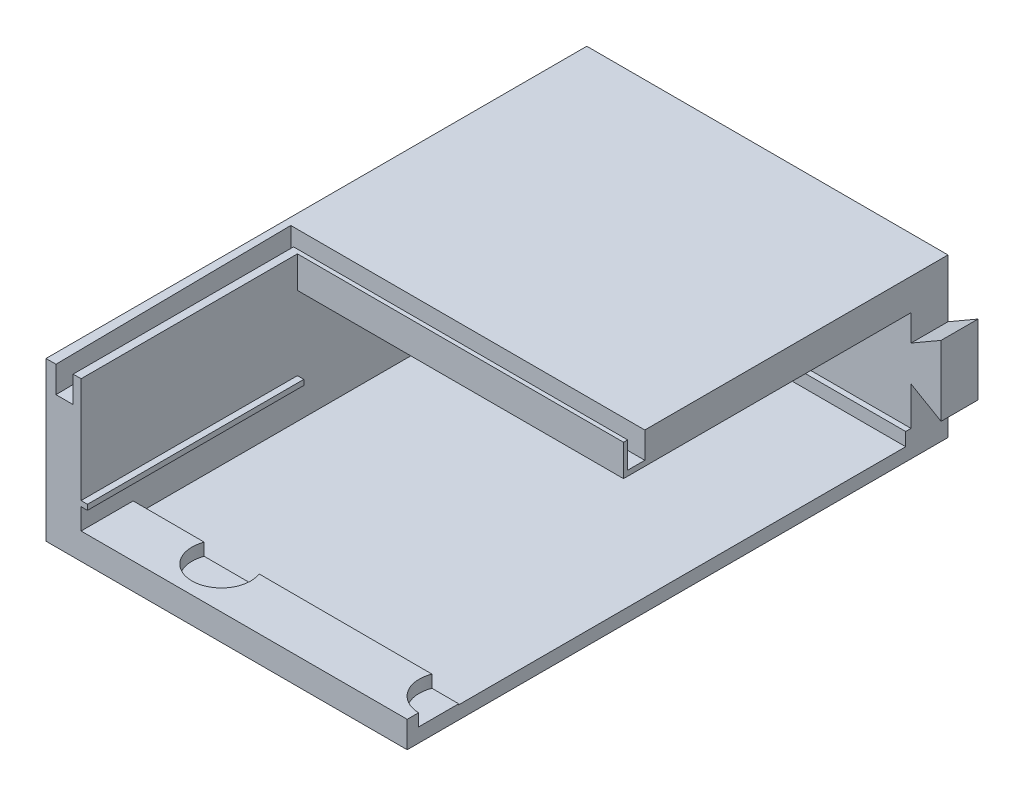
ISO-10303-21;
HEADER;
FILE_DESCRIPTION(('STEP AP214'),'2;1');
FILE_NAME('part.step','',(''),(''),'','','');
FILE_SCHEMA(('AUTOMOTIVE_DESIGN { 1 0 10303 214 1 1 1 1 }'));
ENDSEC;
DATA;
#1=APPLICATION_CONTEXT('core data for automotive mechanical design processes');
#2=APPLICATION_PROTOCOL_DEFINITION('international standard','automotive_design',2000,#1);
#3=PRODUCT_CONTEXT('',#1,'mechanical');
#4=PRODUCT('Part','Part','',(#3));
#5=PRODUCT_RELATED_PRODUCT_CATEGORY('part','',(#4));
#6=PRODUCT_DEFINITION_FORMATION('','',#4);
#7=PRODUCT_DEFINITION_CONTEXT('part definition',#1,'design');
#8=PRODUCT_DEFINITION('design','',#6,#7);
#9=PRODUCT_DEFINITION_SHAPE('','',#8);
#10=(LENGTH_UNIT() NAMED_UNIT(*) SI_UNIT(.MILLI.,.METRE.));
#11=(NAMED_UNIT(*) PLANE_ANGLE_UNIT() SI_UNIT($,.RADIAN.));
#12=(NAMED_UNIT(*) SI_UNIT($,.STERADIAN.) SOLID_ANGLE_UNIT());
#13=UNCERTAINTY_MEASURE_WITH_UNIT(LENGTH_MEASURE(1.E-05),#10,'distance_accuracy_value','');
#14=(GEOMETRIC_REPRESENTATION_CONTEXT(3) GLOBAL_UNCERTAINTY_ASSIGNED_CONTEXT((#13)) GLOBAL_UNIT_ASSIGNED_CONTEXT((#10,
#11,#12)) REPRESENTATION_CONTEXT('',''));
#15=CARTESIAN_POINT('',(0.,0.,0.));
#16=DIRECTION('',(0.,0.,1.));
#17=DIRECTION('',(1.,0.,0.));
#18=AXIS2_PLACEMENT_3D('',#15,#16,#17);
#19=CARTESIAN_POINT('',(131.625,38.0210152059206,-115.01));
#20=DIRECTION('',(1.,0.,0.));
#21=DIRECTION('',(0.,0.,-1.));
#22=AXIS2_PLACEMENT_3D('',#19,#20,#21);
#23=PLANE('',#22);
#24=DIRECTION('',(0.,-1.,0.));
#25=VECTOR('',#24,1.);
#26=CARTESIAN_POINT('',(131.625,60.,-115.));
#27=LINE('',#26,#25);
#28=CARTESIAN_POINT('',(131.625,59.9507551826827,-115.));
#29=VERTEX_POINT('',#28);
#30=CARTESIAN_POINT('',(131.625,38.0210152059206,-115.));
#31=VERTEX_POINT('',#30);
#32=EDGE_CURVE('E391',#29,#31,#27,.T.);
#33=ORIENTED_EDGE('',*,*,#32,.F.);
#34=DIRECTION('',(0.,0.,1.));
#35=VECTOR('',#34,1.);
#36=CARTESIAN_POINT('',(131.625,59.9507551826827,-115.01));
#37=LINE('',#36,#35);
#38=CARTESIAN_POINT('',(131.625,59.9507551826827,-0.0612445611802554));
#39=VERTEX_POINT('',#38);
#40=EDGE_CURVE('E348',#29,#39,#37,.T.);
#41=ORIENTED_EDGE('',*,*,#40,.T.);
#42=DIRECTION('',(0.,1.,0.));
#43=VECTOR('',#42,1.);
#44=CARTESIAN_POINT('',(131.625,50.,-0.0612445611802554));
#45=LINE('',#44,#43);
#46=CARTESIAN_POINT('',(131.625,50.,-0.0612445611802554));
#47=VERTEX_POINT('',#46);
#48=EDGE_CURVE('E383',#47,#39,#45,.T.);
#49=ORIENTED_EDGE('',*,*,#48,.F.);
#50=DIRECTION('',(0.,0.,-1.));
#51=VECTOR('',#50,1.);
#52=CARTESIAN_POINT('',(131.625,50.,0.));
#53=LINE('',#52,#51);
#54=CARTESIAN_POINT('',(131.625,50.,6.43875543881975));
#55=VERTEX_POINT('',#54);
#56=EDGE_CURVE('E377',#55,#47,#53,.T.);
#57=ORIENTED_EDGE('',*,*,#56,.F.);
#58=DIRECTION('',(0.,1.,0.));
#59=VECTOR('',#58,1.);
#60=CARTESIAN_POINT('',(131.625,50.,6.43875543881975));
#61=LINE('',#60,#59);
#62=CARTESIAN_POINT('',(131.625,59.9507551826827,6.43875543881975));
#63=VERTEX_POINT('',#62);
#64=EDGE_CURVE('E419',#55,#63,#61,.T.);
#65=ORIENTED_EDGE('',*,*,#64,.T.);
#66=CARTESIAN_POINT('',(131.625,59.9507551826827,8.));
#67=VERTEX_POINT('',#66);
#68=EDGE_CURVE('E53',#63,#67,#37,.T.);
#69=ORIENTED_EDGE('',*,*,#68,.T.);
#70=DIRECTION('',(0.,-1.,0.));
#71=VECTOR('',#70,1.);
#72=CARTESIAN_POINT('',(131.625,9.99999999999999,8.));
#73=LINE('',#72,#71);
#74=CARTESIAN_POINT('',(131.625,48.,8.));
#75=VERTEX_POINT('',#74);
#76=EDGE_CURVE('E258',#67,#75,#73,.T.);
#77=ORIENTED_EDGE('',*,*,#76,.T.);
#78=DIRECTION('',(0.,0.,-1.));
#79=VECTOR('',#78,1.);
#80=CARTESIAN_POINT('',(131.625,48.,-101.));
#81=LINE('',#80,#79);
#82=CARTESIAN_POINT('',(131.625,48.,-101.));
#83=VERTEX_POINT('',#82);
#84=EDGE_CURVE('E266',#75,#83,#81,.T.);
#85=ORIENTED_EDGE('',*,*,#84,.T.);
#86=DIRECTION('',(0.,1.,0.));
#87=VECTOR('',#86,1.);
#88=CARTESIAN_POINT('',(131.625,0.,-101.));
#89=LINE('',#88,#87);
#90=CARTESIAN_POINT('',(131.625,38.0210152059206,-101.));
#91=VERTEX_POINT('',#90);
#92=EDGE_CURVE('E356',#91,#83,#89,.T.);
#93=ORIENTED_EDGE('',*,*,#92,.F.);
#94=DIRECTION('',(0.,0.,1.));
#95=VECTOR('',#94,1.);
#96=CARTESIAN_POINT('',(131.625,38.0210152059206,-115.01));
#97=LINE('',#96,#95);
#98=EDGE_CURVE('E11',#31,#91,#97,.T.);
#99=ORIENTED_EDGE('',*,*,#98,.F.);
#100=EDGE_LOOP('',(#33,#41,#49,#57,#65,#69,#77,#85,#93,#99));
#101=FACE_BOUND('',#100,.T.);
#102=ADVANCED_FACE('F43',(#101),#23,.T.);
#103=CARTESIAN_POINT('',(-5.2976725084512,60.,-115.01));
#104=DIRECTION('',(0.000359654199192794,0.999999935324426,0.));
#105=DIRECTION('',(-0.999999935324427,0.000359654199192794,0.));
#106=AXIS2_PLACEMENT_3D('',#103,#104,#105);
#107=PLANE('',#106);
#108=DIRECTION('',(0.999999935324427,-0.000359654199192794,0.));
#109=VECTOR('',#108,1.);
#110=CARTESIAN_POINT('',(-5.2976725084512,60.,-115.));
#111=LINE('',#110,#109);
#112=CARTESIAN_POINT('',(-5.2976725084512,60.,-115.));
#113=VERTEX_POINT('',#112);
#114=EDGE_CURVE('E406',#113,#29,#111,.T.);
#115=ORIENTED_EDGE('',*,*,#114,.F.);
#116=DIRECTION('',(0.,0.,-1.));
#117=VECTOR('',#116,1.);
#118=CARTESIAN_POINT('',(-5.2976725084512,60.,90.));
#119=LINE('',#118,#117);
#120=CARTESIAN_POINT('',(-5.2976725084512,60.,90.));
#121=VERTEX_POINT('',#120);
#122=EDGE_CURVE('E285',#121,#113,#119,.T.);
#123=ORIENTED_EDGE('',*,*,#122,.F.);
#124=DIRECTION('',(-0.999999935324427,0.000359654199192794,0.));
#125=VECTOR('',#124,1.);
#126=CARTESIAN_POINT('',(-6.8525998317018E-07,59.9980946699596,90.));
#127=LINE('',#126,#125);
#128=CARTESIAN_POINT('',(-1.5186079351983,59.9986408434693,90.000001141251));
#129=VERTEX_POINT('',#128);
#130=EDGE_CURVE('E412',#129,#121,#127,.T.);
#131=ORIENTED_EDGE('',*,*,#130,.F.);
#132=DIRECTION('',(0.0116493265600538,-4.18972948606465E-06,0.999932144284373));
#133=VECTOR('',#132,1.);
#134=CARTESIAN_POINT('',(-1.51860744718936,59.9986408432938,90.0000430300088));
#135=LINE('',#134,#133);
#136=CARTESIAN_POINT('',(-2.56783199264043,59.9990182013319,-0.0612445611802554));
#137=VERTEX_POINT('',#136);
#138=EDGE_CURVE('E379',#137,#129,#135,.T.);
#139=ORIENTED_EDGE('',*,*,#138,.F.);
#140=DIRECTION('',(-0.999999935324427,0.000359654199192794,0.));
#141=VECTOR('',#140,1.);
#142=CARTESIAN_POINT('',(-2.5642358039891,59.9990169079474,-0.0612445611802538));
#143=LINE('',#142,#141);
#144=EDGE_CURVE('E386',#39,#137,#143,.T.);
#145=ORIENTED_EDGE('',*,*,#144,.F.);
#146=ORIENTED_EDGE('',*,*,#40,.F.);
#147=EDGE_LOOP('',(#115,#123,#131,#139,#145,#146));
#148=FACE_BOUND('',#147,.T.);
#149=ADVANCED_FACE('F505',(#148),#107,.T.);
#150=ORIENTED_EDGE('',*,*,#68,.F.);
#151=DIRECTION('',(-0.999999935324427,0.000359654199192794,0.));
#152=VECTOR('',#151,1.);
#153=CARTESIAN_POINT('',(4.98498727695216,59.9963017979901,6.43875543881975));
#154=LINE('',#153,#152);
#155=CARTESIAN_POINT('',(4.98139206480159,59.9963030910234,6.43875543881975));
#156=VERTEX_POINT('',#155);
#157=EDGE_CURVE('E270',#63,#156,#154,.T.);
#158=ORIENTED_EDGE('',*,*,#157,.T.);
#159=DIRECTION('',(0.,0.,-1.));
#160=VECTOR('',#159,1.);
#161=CARTESIAN_POINT('',(4.98139206480159,59.9963030910234,6.43875543881975));
#162=LINE('',#161,#160);
#163=CARTESIAN_POINT('',(4.9813920648016,59.9963030910234,90.));
#164=VERTEX_POINT('',#163);
#165=EDGE_CURVE('E381',#164,#156,#162,.T.);
#166=ORIENTED_EDGE('',*,*,#165,.F.);
#167=CARTESIAN_POINT('',(8.00000000000001,59.9952174359335,90.));
#168=VERTEX_POINT('',#167);
#169=EDGE_CURVE('E415',#168,#164,#127,.T.);
#170=ORIENTED_EDGE('',*,*,#169,.F.);
#171=DIRECTION('',(0.,0.,-1.));
#172=VECTOR('',#171,1.);
#173=CARTESIAN_POINT('',(8.,59.9952174359335,8.));
#174=LINE('',#173,#172);
#175=CARTESIAN_POINT('',(8.,59.9952174359335,8.));
#176=VERTEX_POINT('',#175);
#177=EDGE_CURVE('E421',#168,#176,#174,.T.);
#178=ORIENTED_EDGE('',*,*,#177,.T.);
#179=DIRECTION('',(0.999999935324426,-0.000359654199192794,0.));
#180=VECTOR('',#179,1.);
#181=CARTESIAN_POINT('',(255.267949006657,59.9062864739958,8.));
#182=LINE('',#181,#180);
#183=EDGE_CURVE('E269',#176,#67,#182,.T.);
#184=ORIENTED_EDGE('',*,*,#183,.T.);
#185=EDGE_LOOP('',(#150,#158,#166,#170,#178,#184));
#186=FACE_BOUND('',#185,.T.);
#187=ADVANCED_FACE('F519',(#186),#107,.T.);
#188=CARTESIAN_POINT('',(142.996381437181,44.5862853397348,-115.01));
#189=DIRECTION('',(-0.499999999999997,0.86602540378444,0.));
#190=DIRECTION('',(-0.86602540378444,-0.499999999999997,0.));
#191=AXIS2_PLACEMENT_3D('',#188,#189,#190);
#192=PLANE('',#191);
#193=DIRECTION('',(0.86602540378444,0.499999999999997,0.));
#194=VECTOR('',#193,1.);
#195=CARTESIAN_POINT('',(38.4501752091935,-15.7734949687474,-115.));
#196=LINE('',#195,#194);
#197=CARTESIAN_POINT('',(142.996381437181,44.5862853397348,-115.));
#198=VERTEX_POINT('',#197);
#199=EDGE_CURVE('E394',#31,#198,#196,.T.);
#200=ORIENTED_EDGE('',*,*,#199,.F.);
#201=ORIENTED_EDGE('',*,*,#98,.T.);
#202=DIRECTION('',(-0.86602540378444,-0.499999999999997,0.));
#203=VECTOR('',#202,1.);
#204=CARTESIAN_POINT('',(16.4426674769989,-28.4795354821226,-101.));
#205=LINE('',#204,#203);
#206=CARTESIAN_POINT('',(142.996381437181,44.5862853397348,-101.));
#207=VERTEX_POINT('',#206);
#208=EDGE_CURVE('E359',#207,#91,#205,.T.);
#209=ORIENTED_EDGE('',*,*,#208,.F.);
#210=DIRECTION('',(0.,0.,1.));
#211=VECTOR('',#210,1.);
#212=CARTESIAN_POINT('',(142.996381437181,44.5862853397348,-115.01));
#213=LINE('',#212,#211);
#214=EDGE_CURVE('E349',#198,#207,#213,.T.);
#215=ORIENTED_EDGE('',*,*,#214,.F.);
#216=EDGE_LOOP('',(#200,#201,#209,#215));
#217=FACE_BOUND('',#216,.T.);
#218=ADVANCED_FACE('F515',(#217),#192,.T.);
#219=CARTESIAN_POINT('',(142.996381437181,44.5862853397348,-115.01));
#220=DIRECTION('',(1.,0.,0.));
#221=DIRECTION('',(0.,0.,-1.));
#222=AXIS2_PLACEMENT_3D('',#219,#220,#221);
#223=PLANE('',#222);
#224=DIRECTION('',(0.,-1.,0.));
#225=VECTOR('',#224,1.);
#226=CARTESIAN_POINT('',(142.996381437181,60.,-115.));
#227=LINE('',#226,#225);
#228=CARTESIAN_POINT('',(142.996381437181,18.0143801043625,-115.));
#229=VERTEX_POINT('',#228);
#230=EDGE_CURVE('E397',#198,#229,#227,.T.);
#231=ORIENTED_EDGE('',*,*,#230,.F.);
#232=ORIENTED_EDGE('',*,*,#214,.T.);
#233=DIRECTION('',(0.,1.,0.));
#234=VECTOR('',#233,1.);
#235=CARTESIAN_POINT('',(142.996381437181,0.,-101.));
#236=LINE('',#235,#234);
#237=CARTESIAN_POINT('',(142.996381437181,18.0143801043625,-101.));
#238=VERTEX_POINT('',#237);
#239=EDGE_CURVE('E362',#238,#207,#236,.T.);
#240=ORIENTED_EDGE('',*,*,#239,.F.);
#241=DIRECTION('',(0.,0.,1.));
#242=VECTOR('',#241,1.);
#243=CARTESIAN_POINT('',(142.996381437181,18.0143801043625,-115.01));
#244=LINE('',#243,#242);
#245=EDGE_CURVE('E351',#229,#238,#244,.T.);
#246=ORIENTED_EDGE('',*,*,#245,.F.);
#247=EDGE_LOOP('',(#231,#232,#240,#246));
#248=FACE_BOUND('',#247,.T.);
#249=ADVANCED_FACE('F518',(#248),#223,.T.);
#250=CARTESIAN_POINT('',(142.996381437181,18.0143801043625,-115.01));
#251=DIRECTION('',(-0.499999999999997,-0.866025403784441,0.));
#252=DIRECTION('',(0.866025403784441,-0.499999999999997,0.));
#253=AXIS2_PLACEMENT_3D('',#250,#251,#252);
#254=PLANE('',#253);
#255=DIRECTION('',(-0.866025403784441,0.499999999999997,0.));
#256=VECTOR('',#255,1.);
#257=CARTESIAN_POINT('',(13.5955342663267,92.7239940518201,-115.));
#258=LINE('',#257,#256);
#259=CARTESIAN_POINT('',(131.625,24.5796502381768,-115.));
#260=VERTEX_POINT('',#259);
#261=EDGE_CURVE('E400',#229,#260,#258,.T.);
#262=ORIENTED_EDGE('',*,*,#261,.F.);
#263=ORIENTED_EDGE('',*,*,#245,.T.);
#264=DIRECTION('',(0.866025403784441,-0.499999999999997,0.));
#265=VECTOR('',#264,1.);
#266=CARTESIAN_POINT('',(43.5495507611981,75.4300345651957,-101.));
#267=LINE('',#266,#265);
#268=CARTESIAN_POINT('',(131.625,24.5796502381768,-101.));
#269=VERTEX_POINT('',#268);
#270=EDGE_CURVE('E365',#269,#238,#267,.T.);
#271=ORIENTED_EDGE('',*,*,#270,.F.);
#272=DIRECTION('',(0.,0.,1.));
#273=VECTOR('',#272,1.);
#274=CARTESIAN_POINT('',(131.625,24.5796502381768,-115.01));
#275=LINE('',#274,#273);
#276=EDGE_CURVE('E261',#260,#269,#275,.T.);
#277=ORIENTED_EDGE('',*,*,#276,.F.);
#278=EDGE_LOOP('',(#262,#263,#271,#277));
#279=FACE_BOUND('',#278,.T.);
#280=ADVANCED_FACE('F476',(#279),#254,.T.);
#281=CARTESIAN_POINT('',(131.625,-0.0543782899306133,-115.01));
#282=DIRECTION('',(1.,0.,0.));
#283=DIRECTION('',(0.,1.,0.));
#284=AXIS2_PLACEMENT_3D('',#281,#282,#283);
#285=PLANE('',#284);
#286=DIRECTION('',(0.,-1.,0.));
#287=VECTOR('',#286,1.);
#288=CARTESIAN_POINT('',(131.624999999999,60.0000000000012,-115.));
#289=LINE('',#288,#287);
#290=CARTESIAN_POINT('',(131.625,0.,-115.));
#291=VERTEX_POINT('',#290);
#292=EDGE_CURVE('E403',#260,#291,#289,.T.);
#293=ORIENTED_EDGE('',*,*,#292,.F.);
#294=ORIENTED_EDGE('',*,*,#276,.T.);
#295=DIRECTION('',(0.,1.,0.));
#296=VECTOR('',#295,1.);
#297=CARTESIAN_POINT('',(131.625,1.18643286825416E-12,-101.));
#298=LINE('',#297,#296);
#299=CARTESIAN_POINT('',(131.625,9.99999999999999,-101.));
#300=VERTEX_POINT('',#299);
#301=EDGE_CURVE('E368',#300,#269,#298,.T.);
#302=ORIENTED_EDGE('',*,*,#301,.F.);
#303=DIRECTION('',(0.,0.,1.));
#304=VECTOR('',#303,1.);
#305=CARTESIAN_POINT('',(131.625,9.99999999999999,-101.));
#306=LINE('',#305,#304);
#307=CARTESIAN_POINT('',(131.625,9.99999999999999,-98.9628021729257));
#308=VERTEX_POINT('',#307);
#309=EDGE_CURVE('E274',#300,#308,#306,.T.);
#310=ORIENTED_EDGE('',*,*,#309,.T.);
#311=DIRECTION('',(0.,-1.,0.));
#312=VECTOR('',#311,1.);
#313=CARTESIAN_POINT('',(131.625,5.00000000000111,-98.9628021729257));
#314=LINE('',#313,#312);
#315=CARTESIAN_POINT('',(131.625,4.99999999999999,-98.9628021729257));
#316=VERTEX_POINT('',#315);
#317=EDGE_CURVE('E430',#308,#316,#314,.T.);
#318=ORIENTED_EDGE('',*,*,#317,.T.);
#319=DIRECTION('',(0.,0.,1.));
#320=VECTOR('',#319,1.);
#321=CARTESIAN_POINT('',(131.625,4.99999999999999,0.));
#322=LINE('',#321,#320);
#323=CARTESIAN_POINT('',(131.625,4.99999999999999,70.4851481283429));
#324=VERTEX_POINT('',#323);
#325=EDGE_CURVE('E277',#316,#324,#322,.T.);
#326=ORIENTED_EDGE('',*,*,#325,.T.);
#327=DIRECTION('',(0.,1.,0.));
#328=VECTOR('',#327,1.);
#329=CARTESIAN_POINT('',(131.625,5.00000000000111,70.4851481283429));
#330=LINE('',#329,#328);
#331=CARTESIAN_POINT('',(131.625,5.33999999999999,70.485148128343));
#332=VERTEX_POINT('',#331);
#333=EDGE_CURVE('E427',#324,#332,#330,.T.);
#334=ORIENTED_EDGE('',*,*,#333,.T.);
#335=DIRECTION('',(0.,0.,-1.));
#336=VECTOR('',#335,1.);
#337=CARTESIAN_POINT('',(131.625,5.33999999999999,74.522104321755));
#338=LINE('',#337,#336);
#339=CARTESIAN_POINT('',(131.625,5.33999999999999,85.6696744542363));
#340=VERTEX_POINT('',#339);
#341=EDGE_CURVE('E371',#340,#332,#338,.T.);
#342=ORIENTED_EDGE('',*,*,#341,.F.);
#343=DIRECTION('',(0.,1.,0.));
#344=VECTOR('',#343,1.);
#345=CARTESIAN_POINT('',(131.625,5.33999999999999,85.6696744542363));
#346=LINE('',#345,#344);
#347=CARTESIAN_POINT('',(131.625,9.99999999999999,85.6696744542363));
#348=VERTEX_POINT('',#347);
#349=EDGE_CURVE('E424',#340,#348,#346,.T.);
#350=ORIENTED_EDGE('',*,*,#349,.T.);
#351=DIRECTION('',(0.,0.,-1.));
#352=VECTOR('',#351,1.);
#353=CARTESIAN_POINT('',(131.625,9.99999999999999,0.));
#354=LINE('',#353,#352);
#355=CARTESIAN_POINT('',(131.625,9.99999999999999,90.));
#356=VERTEX_POINT('',#355);
#357=EDGE_CURVE('E374',#356,#348,#354,.T.);
#358=ORIENTED_EDGE('',*,*,#357,.F.);
#359=DIRECTION('',(0.,1.,0.));
#360=VECTOR('',#359,1.);
#361=CARTESIAN_POINT('',(131.624999999999,60.0000000000012,90.));
#362=LINE('',#361,#360);
#363=CARTESIAN_POINT('',(131.625,0.,90.));
#364=VERTEX_POINT('',#363);
#365=EDGE_CURVE('E409',#364,#356,#362,.T.);
#366=ORIENTED_EDGE('',*,*,#365,.F.);
#367=DIRECTION('',(0.,0.,1.));
#368=VECTOR('',#367,1.);
#369=CARTESIAN_POINT('',(131.625,0.,0.));
#370=LINE('',#369,#368);
#371=EDGE_CURVE('E389',#291,#364,#370,.T.);
#372=ORIENTED_EDGE('',*,*,#371,.F.);
#373=EDGE_LOOP('',(#293,#294,#302,#310,#318,#326,#334,#342,#350,#358,#366,#372));
#374=FACE_BOUND('',#373,.T.);
#375=ADVANCED_FACE('F436',(#374),#285,.T.);
#376=CARTESIAN_POINT('',(10.4282385352864,20.,4.99999999999999));
#377=DIRECTION('',(1.,0.,0.));
#378=DIRECTION('',(0.,0.,-1.));
#379=AXIS2_PLACEMENT_3D('',#376,#377,#378);
#380=PLANE('',#379);
#381=DIRECTION('',(0.,-1.,0.));
#382=VECTOR('',#381,1.);
#383=CARTESIAN_POINT('',(10.4282385352864,9.99999999999999,8.));
#384=LINE('',#383,#382);
#385=CARTESIAN_POINT('',(10.4282385352864,20.,8.));
#386=VERTEX_POINT('',#385);
#387=CARTESIAN_POINT('',(10.4282385352864,18.,8.));
#388=VERTEX_POINT('',#387);
#389=EDGE_CURVE('E358',#386,#388,#384,.T.);
#390=ORIENTED_EDGE('',*,*,#389,.F.);
#391=DIRECTION('',(0.,0.,1.));
#392=VECTOR('',#391,1.);
#393=CARTESIAN_POINT('',(10.4282385352864,20.,4.99999999999999));
#394=LINE('',#393,#392);
#395=CARTESIAN_POINT('',(10.4282385352864,20.,90.));
#396=VERTEX_POINT('',#395);
#397=EDGE_CURVE('E628',#386,#396,#394,.T.);
#398=ORIENTED_EDGE('',*,*,#397,.T.);
#399=DIRECTION('',(0.,1.,0.));
#400=VECTOR('',#399,1.);
#401=CARTESIAN_POINT('',(10.4282385352864,20.,90.));
#402=LINE('',#401,#400);
#403=CARTESIAN_POINT('',(10.4282385352864,18.,90.));
#404=VERTEX_POINT('',#403);
#405=EDGE_CURVE('E634',#404,#396,#402,.T.);
#406=ORIENTED_EDGE('',*,*,#405,.F.);
#407=DIRECTION('',(0.,0.,1.));
#408=VECTOR('',#407,1.);
#409=CARTESIAN_POINT('',(10.4282385352864,18.,4.99999999999999));
#410=LINE('',#409,#408);
#411=EDGE_CURVE('E629',#388,#404,#410,.T.);
#412=ORIENTED_EDGE('',*,*,#411,.F.);
#413=EDGE_LOOP('',(#390,#398,#406,#412));
#414=FACE_BOUND('',#413,.T.);
#415=ADVANCED_FACE('F492',(#414),#380,.T.);
#416=CARTESIAN_POINT('',(4.98139206480159,50.,6.43875543881975));
#417=DIRECTION('',(-1.,0.,0.));
#418=DIRECTION('',(0.,0.,1.));
#419=AXIS2_PLACEMENT_3D('',#416,#417,#418);
#420=PLANE('',#419);
#421=DIRECTION('',(0.,1.,0.));
#422=VECTOR('',#421,1.);
#423=CARTESIAN_POINT('',(4.9813920648016,50.,90.));
#424=LINE('',#423,#422);
#425=CARTESIAN_POINT('',(4.9813920648016,50.,90.));
#426=VERTEX_POINT('',#425);
#427=EDGE_CURVE('E291',#426,#164,#424,.T.);
#428=ORIENTED_EDGE('',*,*,#427,.T.);
#429=ORIENTED_EDGE('',*,*,#165,.T.);
#430=DIRECTION('',(0.,1.,0.));
#431=VECTOR('',#430,1.);
#432=CARTESIAN_POINT('',(4.98139206480159,50.,6.43875543881975));
#433=LINE('',#432,#431);
#434=CARTESIAN_POINT('',(4.98139206480159,50.,6.43875543881975));
#435=VERTEX_POINT('',#434);
#436=EDGE_CURVE('E288',#435,#156,#433,.T.);
#437=ORIENTED_EDGE('',*,*,#436,.F.);
#438=DIRECTION('',(0.,0.,1.));
#439=VECTOR('',#438,1.);
#440=CARTESIAN_POINT('',(4.98139206480159,50.,6.43875543881975));
#441=LINE('',#440,#439);
#442=EDGE_CURVE('E305',#435,#426,#441,.T.);
#443=ORIENTED_EDGE('',*,*,#442,.T.);
#444=EDGE_LOOP('',(#428,#429,#437,#443));
#445=FACE_BOUND('',#444,.T.);
#446=ADVANCED_FACE('F494',(#445),#420,.T.);
#447=CARTESIAN_POINT('',(10.4282385352864,18.,4.99999999999999));
#448=DIRECTION('',(0.,-1.,0.));
#449=DIRECTION('',(0.,0.,-1.));
#450=AXIS2_PLACEMENT_3D('',#447,#448,#449);
#451=PLANE('',#450);
#452=DIRECTION('',(-1.,0.,0.));
#453=VECTOR('',#452,1.);
#454=CARTESIAN_POINT('',(255.25,18.,8.));
#455=LINE('',#454,#453);
#456=CARTESIAN_POINT('',(8.00000000000001,18.,8.));
#457=VERTEX_POINT('',#456);
#458=EDGE_CURVE('E85',#388,#457,#455,.T.);
#459=ORIENTED_EDGE('',*,*,#458,.F.);
#460=ORIENTED_EDGE('',*,*,#411,.T.);
#461=DIRECTION('',(1.,0.,0.));
#462=VECTOR('',#461,1.);
#463=CARTESIAN_POINT('',(10.4282385352864,18.,90.));
#464=LINE('',#463,#462);
#465=CARTESIAN_POINT('',(7.99999999999999,18.,90.));
#466=VERTEX_POINT('',#465);
#467=EDGE_CURVE('E637',#466,#404,#464,.T.);
#468=ORIENTED_EDGE('',*,*,#467,.F.);
#469=DIRECTION('',(0.,0.,1.));
#470=VECTOR('',#469,1.);
#471=CARTESIAN_POINT('',(8.,18.,8.));
#472=LINE('',#471,#470);
#473=EDGE_CURVE('E856',#457,#466,#472,.T.);
#474=ORIENTED_EDGE('',*,*,#473,.F.);
#475=EDGE_LOOP('',(#459,#460,#468,#474));
#476=FACE_BOUND('',#475,.T.);
#477=ADVANCED_FACE('F501',(#476),#451,.T.);
#478=CARTESIAN_POINT('',(0.,0.,8.));
#479=DIRECTION('',(0.,0.,1.));
#480=DIRECTION('',(1.,0.,0.));
#481=AXIS2_PLACEMENT_3D('',#478,#479,#480);
#482=PLANE('',#481);
#483=DIRECTION('',(1.,0.,0.));
#484=VECTOR('',#483,1.);
#485=CARTESIAN_POINT('',(255.25,20.,8.));
#486=LINE('',#485,#484);
#487=CARTESIAN_POINT('',(8.00000000000001,20.,8.));
#488=VERTEX_POINT('',#487);
#489=EDGE_CURVE('E625',#488,#386,#486,.T.);
#490=ORIENTED_EDGE('',*,*,#489,.T.);
#491=ORIENTED_EDGE('',*,*,#389,.T.);
#492=ORIENTED_EDGE('',*,*,#458,.T.);
#493=DIRECTION('',(0.,-1.,0.));
#494=VECTOR('',#493,1.);
#495=CARTESIAN_POINT('',(8.00000000000001,48.,8.));
#496=LINE('',#495,#494);
#497=EDGE_CURVE('E80',#488,#457,#496,.T.);
#498=ORIENTED_EDGE('',*,*,#497,.F.);
#499=EDGE_LOOP('',(#490,#491,#492,#498));
#500=FACE_BOUND('',#499,.T.);
#501=ADVANCED_FACE('F513',(#500),#482,.F.);
#502=CARTESIAN_POINT('',(7.99999999999999,20.,4.99999999999999));
#503=DIRECTION('',(0.,1.,0.));
#504=DIRECTION('',(0.,0.,1.));
#505=AXIS2_PLACEMENT_3D('',#502,#503,#504);
#506=PLANE('',#505);
#507=ORIENTED_EDGE('',*,*,#489,.F.);
#508=DIRECTION('',(0.,0.,-1.));
#509=VECTOR('',#508,1.);
#510=CARTESIAN_POINT('',(8.,20.,8.));
#511=LINE('',#510,#509);
#512=CARTESIAN_POINT('',(8.00000000000001,20.,90.));
#513=VERTEX_POINT('',#512);
#514=EDGE_CURVE('E861',#513,#488,#511,.T.);
#515=ORIENTED_EDGE('',*,*,#514,.F.);
#516=DIRECTION('',(-1.,0.,0.));
#517=VECTOR('',#516,1.);
#518=CARTESIAN_POINT('',(7.99999999999999,20.,90.));
#519=LINE('',#518,#517);
#520=EDGE_CURVE('E631',#396,#513,#519,.T.);
#521=ORIENTED_EDGE('',*,*,#520,.F.);
#522=ORIENTED_EDGE('',*,*,#397,.F.);
#523=EDGE_LOOP('',(#507,#515,#521,#522));
#524=FACE_BOUND('',#523,.T.);
#525=ADVANCED_FACE('F510',(#524),#506,.T.);
#526=CARTESIAN_POINT('',(0.,60.,90.));
#527=DIRECTION('',(0.,0.,1.));
#528=DIRECTION('',(1.,0.,0.));
#529=AXIS2_PLACEMENT_3D('',#526,#527,#528);
#530=PLANE('',#529);
#531=DIRECTION('',(0.,1.,0.));
#532=VECTOR('',#531,1.);
#533=CARTESIAN_POINT('',(8.00000000000001,9.99999999999999,90.));
#534=LINE('',#533,#532);
#535=EDGE_CURVE('E311',#513,#168,#534,.T.);
#536=ORIENTED_EDGE('',*,*,#535,.T.);
#537=ORIENTED_EDGE('',*,*,#169,.T.);
#538=ORIENTED_EDGE('',*,*,#427,.F.);
#539=DIRECTION('',(0.999999999999985,0.,-1.75577074247057E-07));
#540=VECTOR('',#539,1.);
#541=CARTESIAN_POINT('',(-1.5186079351983,50.,90.000001141251));
#542=LINE('',#541,#540);
#543=CARTESIAN_POINT('',(-1.5186079351983,50.,90.000001141251));
#544=VERTEX_POINT('',#543);
#545=EDGE_CURVE('E600',#544,#426,#542,.T.);
#546=ORIENTED_EDGE('',*,*,#545,.F.);
#547=DIRECTION('',(0.,1.,0.));
#548=VECTOR('',#547,1.);
#549=CARTESIAN_POINT('',(-1.5186079351983,50.,90.000001141251));
#550=LINE('',#549,#548);
#551=EDGE_CURVE('E294',#544,#129,#550,.T.);
#552=ORIENTED_EDGE('',*,*,#551,.T.);
#553=ORIENTED_EDGE('',*,*,#130,.T.);
#554=DIRECTION('',(0.,-1.,0.));
#555=VECTOR('',#554,1.);
#556=CARTESIAN_POINT('',(-5.2976725084512,60.,90.));
#557=LINE('',#556,#555);
#558=CARTESIAN_POINT('',(-5.2976725084512,0.,90.));
#559=VERTEX_POINT('',#558);
#560=EDGE_CURVE('E355',#121,#559,#557,.T.);
#561=ORIENTED_EDGE('',*,*,#560,.T.);
#562=DIRECTION('',(-1.,0.,0.));
#563=VECTOR('',#562,1.);
#564=CARTESIAN_POINT('',(0.,0.,90.));
#565=LINE('',#564,#563);
#566=EDGE_CURVE('E286',#364,#559,#565,.T.);
#567=ORIENTED_EDGE('',*,*,#566,.F.);
#568=ORIENTED_EDGE('',*,*,#365,.T.);
#569=DIRECTION('',(1.,0.,0.));
#570=VECTOR('',#569,1.);
#571=CARTESIAN_POINT('',(8.00000000000001,9.99999999999999,90.));
#572=LINE('',#571,#570);
#573=CARTESIAN_POINT('',(8.00000000000001,9.99999999999999,90.));
#574=VERTEX_POINT('',#573);
#575=EDGE_CURVE('E313',#574,#356,#572,.T.);
#576=ORIENTED_EDGE('',*,*,#575,.F.);
#577=EDGE_CURVE('E308',#574,#466,#534,.T.);
#578=ORIENTED_EDGE('',*,*,#577,.T.);
#579=ORIENTED_EDGE('',*,*,#467,.T.);
#580=ORIENTED_EDGE('',*,*,#405,.T.);
#581=ORIENTED_EDGE('',*,*,#520,.T.);
#582=EDGE_LOOP('',(#536,#537,#538,#546,#552,#553,#561,#567,#568,#576,#578,#579,#580,#581));
#583=FACE_BOUND('',#582,.T.);
#584=ADVANCED_FACE('F463',(#583),#530,.T.);
#585=CARTESIAN_POINT('',(131.857766280656,5.33999999999999,74.522104321755));
#586=DIRECTION('',(0.,1.,0.));
#587=DIRECTION('',(0.,0.,1.));
#588=AXIS2_PLACEMENT_3D('',#585,#586,#587);
#589=PLANE('',#588);
#590=CARTESIAN_POINT('',(131.857766280656,5.33999999999999,74.522104321755));
#591=DIRECTION('',(0.,1.,0.));
#592=DIRECTION('',(0.,0.,1.));
#593=AXIS2_PLACEMENT_3D('',#590,#591,#592);
#594=CIRCLE('',#593,11.15);
#595=CARTESIAN_POINT('',(121.471660690305,5.33999999999999,70.4660827899976));
#596=VERTEX_POINT('',#595);
#597=EDGE_CURVE('E317',#596,#340,#594,.T.);
#598=ORIENTED_EDGE('',*,*,#597,.T.);
#599=ORIENTED_EDGE('',*,*,#341,.T.);
#600=DIRECTION('',(0.999998237049616,0.,0.00187773737807381));
#601=VECTOR('',#600,1.);
#602=CARTESIAN_POINT('',(131.86534579012,5.33999999999999,70.4855994354124));
#603=LINE('',#602,#601);
#604=EDGE_CURVE('E323',#596,#332,#603,.T.);
#605=ORIENTED_EDGE('',*,*,#604,.F.);
#606=EDGE_LOOP('',(#598,#599,#605));
#607=FACE_BOUND('',#606,.T.);
#608=ADVANCED_FACE('F451',(#607),#589,.T.);
#609=CARTESIAN_POINT('',(131.857766280656,5.33999999999999,74.522104321755));
#610=DIRECTION('',(0.,1.,0.));
#611=DIRECTION('',(0.,0.,1.));
#612=AXIS2_PLACEMENT_3D('',#609,#610,#611);
#613=CYLINDRICAL_SURFACE('',#612,11.15);
#614=ORIENTED_EDGE('',*,*,#349,.F.);
#615=ORIENTED_EDGE('',*,*,#597,.F.);
#616=DIRECTION('',(0.,1.,0.));
#617=VECTOR('',#616,1.);
#618=CARTESIAN_POINT('',(121.471660690305,5.33999999999999,70.4660827899976));
#619=LINE('',#618,#617);
#620=CARTESIAN_POINT('',(121.471660690305,9.99999999999999,70.4660827899976));
#621=VERTEX_POINT('',#620);
#622=EDGE_CURVE('E326',#596,#621,#619,.T.);
#623=ORIENTED_EDGE('',*,*,#622,.T.);
#624=CARTESIAN_POINT('',(131.857766280656,9.99999999999999,74.522104321755));
#625=DIRECTION('',(0.,1.,0.));
#626=DIRECTION('',(0.,0.,1.));
#627=AXIS2_PLACEMENT_3D('',#624,#625,#626);
#628=CIRCLE('',#627,11.15);
#629=EDGE_CURVE('E320',#621,#348,#628,.T.);
#630=ORIENTED_EDGE('',*,*,#629,.T.);
#631=EDGE_LOOP('',(#614,#615,#623,#630));
#632=FACE_BOUND('',#631,.T.);
#633=ADVANCED_FACE('F454',(#632),#613,.F.);
#634=CARTESIAN_POINT('',(45.4096313441434,5.33999999999999,74.2249257103475));
#635=DIRECTION('',(0.,1.,0.));
#636=DIRECTION('',(0.,0.,1.));
#637=AXIS2_PLACEMENT_3D('',#634,#635,#636);
#638=PLANE('',#637);
#639=DIRECTION('',(0.999998237049616,0.,0.00187773737807381));
#640=VECTOR('',#639,1.);
#641=CARTESIAN_POINT('',(45.4169576384815,5.33999999999999,70.3232717795302));
#642=LINE('',#641,#640);
#643=CARTESIAN_POINT('',(34.9719033899041,5.33999999999999,70.3036586761747));
#644=VERTEX_POINT('',#643);
#645=CARTESIAN_POINT('',(55.8620118870589,5.33999999999999,70.3428848828857));
#646=VERTEX_POINT('',#645);
#647=EDGE_CURVE('E618',#644,#646,#642,.T.);
#648=ORIENTED_EDGE('',*,*,#647,.F.);
#649=CARTESIAN_POINT('',(45.4096313441434,5.33999999999999,74.2249257103475));
#650=DIRECTION('',(0.,1.,0.));
#651=DIRECTION('',(0.,0.,1.));
#652=AXIS2_PLACEMENT_3D('',#649,#650,#651);
#653=CIRCLE('',#652,11.15);
#654=EDGE_CURVE('E607',#644,#646,#653,.T.);
#655=ORIENTED_EDGE('',*,*,#654,.T.);
#656=EDGE_LOOP('',(#648,#655));
#657=FACE_BOUND('',#656,.T.);
#658=ADVANCED_FACE('F545',(#657),#638,.T.);
#659=CARTESIAN_POINT('',(45.4096313441434,5.33999999999999,74.2249257103475));
#660=DIRECTION('',(0.,1.,0.));
#661=DIRECTION('',(0.,0.,1.));
#662=AXIS2_PLACEMENT_3D('',#659,#660,#661);
#663=CYLINDRICAL_SURFACE('',#662,11.15);
#664=CARTESIAN_POINT('',(45.4096313441434,9.99999999999999,74.2249257103475));
#665=DIRECTION('',(0.,1.,0.));
#666=DIRECTION('',(0.,0.,1.));
#667=AXIS2_PLACEMENT_3D('',#664,#665,#666);
#668=CIRCLE('',#667,11.15);
#669=CARTESIAN_POINT('',(34.9719033899041,9.99999999999999,70.3036586761747));
#670=VERTEX_POINT('',#669);
#671=CARTESIAN_POINT('',(55.8620118870589,9.99999999999999,70.3428848828857));
#672=VERTEX_POINT('',#671);
#673=EDGE_CURVE('E322',#670,#672,#668,.T.);
#674=ORIENTED_EDGE('',*,*,#673,.T.);
#675=DIRECTION('',(0.,1.,0.));
#676=VECTOR('',#675,1.);
#677=CARTESIAN_POINT('',(55.8620118870589,5.33999999999999,70.3428848828857));
#678=LINE('',#677,#676);
#679=EDGE_CURVE('E325',#672,#646,#678,.F.);
#680=ORIENTED_EDGE('',*,*,#679,.T.);
#681=ORIENTED_EDGE('',*,*,#654,.F.);
#682=DIRECTION('',(0.,1.,0.));
#683=VECTOR('',#682,1.);
#684=CARTESIAN_POINT('',(34.9719033899041,5.33999999999999,70.3036586761747));
#685=LINE('',#684,#683);
#686=EDGE_CURVE('E615',#644,#670,#685,.T.);
#687=ORIENTED_EDGE('',*,*,#686,.T.);
#688=EDGE_LOOP('',(#674,#680,#681,#687));
#689=FACE_BOUND('',#688,.T.);
#690=ADVANCED_FACE('F542',(#689),#663,.F.);
#691=CARTESIAN_POINT('',(0.,9.99999999999999,0.));
#692=DIRECTION('',(0.,1.,0.));
#693=DIRECTION('',(0.,0.,1.));
#694=AXIS2_PLACEMENT_3D('',#691,#692,#693);
#695=PLANE('',#694);
#696=ORIENTED_EDGE('',*,*,#575,.T.);
#697=ORIENTED_EDGE('',*,*,#357,.T.);
#698=ORIENTED_EDGE('',*,*,#629,.F.);
#699=DIRECTION('',(0.999998237049615,0.,0.00187773737807381));
#700=VECTOR('',#699,1.);
#701=CARTESIAN_POINT('',(8.,9.99999999999999,70.2530124357349));
#702=LINE('',#701,#700);
#703=EDGE_CURVE('E336',#672,#621,#702,.T.);
#704=ORIENTED_EDGE('',*,*,#703,.F.);
#705=ORIENTED_EDGE('',*,*,#673,.F.);
#706=CARTESIAN_POINT('',(8.,9.99999999999999,70.2530124357349));
#707=VERTEX_POINT('',#706);
#708=EDGE_CURVE('E334',#707,#670,#702,.T.);
#709=ORIENTED_EDGE('',*,*,#708,.F.);
#710=DIRECTION('',(0.,0.,1.));
#711=VECTOR('',#710,1.);
#712=CARTESIAN_POINT('',(8.,9.99999999999999,8.));
#713=LINE('',#712,#711);
#714=EDGE_CURVE('E316',#707,#574,#713,.T.);
#715=ORIENTED_EDGE('',*,*,#714,.T.);
#716=EDGE_LOOP('',(#696,#697,#698,#704,#705,#709,#715));
#717=FACE_BOUND('',#716,.T.);
#718=ADVANCED_FACE('F458',(#717),#695,.T.);
#719=CARTESIAN_POINT('',(8.,4.99999999999999,70.2530124357349));
#720=DIRECTION('',(-0.00187773737807381,0.,0.999998237049616));
#721=DIRECTION('',(0.999998237049616,0.,0.00187773737807381));
#722=AXIS2_PLACEMENT_3D('',#719,#720,#721);
#723=PLANE('',#722);
#724=ORIENTED_EDGE('',*,*,#333,.F.);
#725=DIRECTION('',(0.999998237049615,0.,0.00187773737807381));
#726=VECTOR('',#725,1.);
#727=CARTESIAN_POINT('',(8.,4.99999999999999,70.2530124357349));
#728=LINE('',#727,#726);
#729=CARTESIAN_POINT('',(8.,4.99999999999999,70.2530124357349));
#730=VERTEX_POINT('',#729);
#731=EDGE_CURVE('E329',#730,#324,#728,.T.);
#732=ORIENTED_EDGE('',*,*,#731,.F.);
#733=DIRECTION('',(0.,1.,0.));
#734=VECTOR('',#733,1.);
#735=CARTESIAN_POINT('',(8.,4.99999999999999,70.2530124357349));
#736=LINE('',#735,#734);
#737=EDGE_CURVE('E620',#730,#707,#736,.T.);
#738=ORIENTED_EDGE('',*,*,#737,.T.);
#739=ORIENTED_EDGE('',*,*,#708,.T.);
#740=ORIENTED_EDGE('',*,*,#686,.F.);
#741=ORIENTED_EDGE('',*,*,#647,.T.);
#742=ORIENTED_EDGE('',*,*,#679,.F.);
#743=ORIENTED_EDGE('',*,*,#703,.T.);
#744=ORIENTED_EDGE('',*,*,#622,.F.);
#745=ORIENTED_EDGE('',*,*,#604,.T.);
#746=EDGE_LOOP('',(#724,#732,#738,#739,#740,#741,#742,#743,#744,#745));
#747=FACE_BOUND('',#746,.T.);
#748=ADVANCED_FACE('F446',(#747),#723,.F.);
#749=CARTESIAN_POINT('',(8.,4.99999999999999,-98.9628021729257));
#750=DIRECTION('',(0.,0.,-1.));
#751=DIRECTION('',(-1.,0.,0.));
#752=AXIS2_PLACEMENT_3D('',#749,#750,#751);
#753=PLANE('',#752);
#754=ORIENTED_EDGE('',*,*,#317,.F.);
#755=DIRECTION('',(-1.,0.,0.));
#756=VECTOR('',#755,1.);
#757=CARTESIAN_POINT('',(8.,9.99999999999999,-98.9628021729257));
#758=LINE('',#757,#756);
#759=CARTESIAN_POINT('',(8.00000000000001,9.99999999999999,-98.9628021729257));
#760=VERTEX_POINT('',#759);
#761=EDGE_CURVE('E332',#308,#760,#758,.T.);
#762=ORIENTED_EDGE('',*,*,#761,.T.);
#763=DIRECTION('',(0.,1.,0.));
#764=VECTOR('',#763,1.);
#765=CARTESIAN_POINT('',(8.,4.99999999999999,-98.9628021729257));
#766=LINE('',#765,#764);
#767=CARTESIAN_POINT('',(8.,4.99999999999999,-98.9628021729257));
#768=VERTEX_POINT('',#767);
#769=EDGE_CURVE('E621',#768,#760,#766,.T.);
#770=ORIENTED_EDGE('',*,*,#769,.F.);
#771=DIRECTION('',(-1.,0.,0.));
#772=VECTOR('',#771,1.);
#773=CARTESIAN_POINT('',(8.,4.99999999999999,-98.9628021729257));
#774=LINE('',#773,#772);
#775=EDGE_CURVE('E327',#316,#768,#774,.T.);
#776=ORIENTED_EDGE('',*,*,#775,.F.);
#777=EDGE_LOOP('',(#754,#762,#770,#776));
#778=FACE_BOUND('',#777,.T.);
#779=ADVANCED_FACE('F550',(#778),#753,.F.);
#780=CARTESIAN_POINT('',(255.25,9.99999999999999,8.));
#781=DIRECTION('',(0.,0.,-1.));
#782=DIRECTION('',(-1.,0.,0.));
#783=AXIS2_PLACEMENT_3D('',#780,#781,#782);
#784=PLANE('',#783);
#785=ORIENTED_EDGE('',*,*,#183,.F.);
#786=DIRECTION('',(0.,1.,0.));
#787=VECTOR('',#786,1.);
#788=CARTESIAN_POINT('',(8.,9.99999999999999,8.));
#789=LINE('',#788,#787);
#790=CARTESIAN_POINT('',(8.00000000000001,48.,8.));
#791=VERTEX_POINT('',#790);
#792=EDGE_CURVE('E260',#791,#176,#789,.T.);
#793=ORIENTED_EDGE('',*,*,#792,.F.);
#794=DIRECTION('',(-1.,0.,0.));
#795=VECTOR('',#794,1.);
#796=CARTESIAN_POINT('',(255.25,48.,8.));
#797=LINE('',#796,#795);
#798=EDGE_CURVE('E47',#75,#791,#797,.T.);
#799=ORIENTED_EDGE('',*,*,#798,.F.);
#800=ORIENTED_EDGE('',*,*,#76,.F.);
#801=EDGE_LOOP('',(#785,#793,#799,#800));
#802=FACE_BOUND('',#801,.T.);
#803=ADVANCED_FACE('F257',(#802),#784,.F.);
#804=CARTESIAN_POINT('',(8.,9.99999999999999,8.));
#805=DIRECTION('',(-1.,0.,0.));
#806=DIRECTION('',(0.,0.,1.));
#807=AXIS2_PLACEMENT_3D('',#804,#805,#806);
#808=PLANE('',#807);
#809=ORIENTED_EDGE('',*,*,#177,.F.);
#810=ORIENTED_EDGE('',*,*,#535,.F.);
#811=ORIENTED_EDGE('',*,*,#514,.T.);
#812=ORIENTED_EDGE('',*,*,#497,.T.);
#813=ORIENTED_EDGE('',*,*,#473,.T.);
#814=ORIENTED_EDGE('',*,*,#577,.F.);
#815=ORIENTED_EDGE('',*,*,#714,.F.);
#816=ORIENTED_EDGE('',*,*,#737,.F.);
#817=DIRECTION('',(0.,0.,1.));
#818=VECTOR('',#817,1.);
#819=CARTESIAN_POINT('',(8.,4.99999999999999,70.2530124357349));
#820=LINE('',#819,#818);
#821=EDGE_CURVE('E330',#768,#730,#820,.T.);
#822=ORIENTED_EDGE('',*,*,#821,.F.);
#823=ORIENTED_EDGE('',*,*,#769,.T.);
#824=DIRECTION('',(0.,0.,1.));
#825=VECTOR('',#824,1.);
#826=CARTESIAN_POINT('',(8.00000000000001,9.99999999999999,-101.));
#827=LINE('',#826,#825);
#828=CARTESIAN_POINT('',(8.00000000000001,9.99999999999999,-101.));
#829=VERTEX_POINT('',#828);
#830=EDGE_CURVE('E72',#829,#760,#827,.T.);
#831=ORIENTED_EDGE('',*,*,#830,.F.);
#832=DIRECTION('',(0.,-1.,0.));
#833=VECTOR('',#832,1.);
#834=CARTESIAN_POINT('',(8.00000000000001,48.,-101.));
#835=LINE('',#834,#833);
#836=CARTESIAN_POINT('',(8.00000000000001,48.,-101.));
#837=VERTEX_POINT('',#836);
#838=EDGE_CURVE('E339',#837,#829,#835,.T.);
#839=ORIENTED_EDGE('',*,*,#838,.F.);
#840=DIRECTION('',(0.,0.,1.));
#841=VECTOR('',#840,1.);
#842=CARTESIAN_POINT('',(8.00000000000001,48.,-101.));
#843=LINE('',#842,#841);
#844=EDGE_CURVE('E340',#837,#791,#843,.T.);
#845=ORIENTED_EDGE('',*,*,#844,.T.);
#846=ORIENTED_EDGE('',*,*,#792,.T.);
#847=EDGE_LOOP('',(#809,#810,#811,#812,#813,#814,#815,#816,#822,#823,#831,#839,#845,#846));
#848=FACE_BOUND('',#847,.T.);
#849=ADVANCED_FACE('F556',(#848),#808,.F.);
#850=CARTESIAN_POINT('',(255.25,48.,-101.));
#851=DIRECTION('',(0.,1.,0.));
#852=DIRECTION('',(0.,0.,1.));
#853=AXIS2_PLACEMENT_3D('',#850,#851,#852);
#854=PLANE('',#853);
#855=ORIENTED_EDGE('',*,*,#84,.F.);
#856=ORIENTED_EDGE('',*,*,#798,.T.);
#857=ORIENTED_EDGE('',*,*,#844,.F.);
#858=DIRECTION('',(-1.,0.,0.));
#859=VECTOR('',#858,1.);
#860=CARTESIAN_POINT('',(255.25,48.,-101.));
#861=LINE('',#860,#859);
#862=EDGE_CURVE('E273',#83,#837,#861,.T.);
#863=ORIENTED_EDGE('',*,*,#862,.F.);
#864=EDGE_LOOP('',(#855,#856,#857,#863));
#865=FACE_BOUND('',#864,.T.);
#866=ADVANCED_FACE('F272',(#865),#854,.F.);
#867=CARTESIAN_POINT('',(8.00000000000001,9.99999999999999,-101.));
#868=DIRECTION('',(0.,-1.,0.));
#869=DIRECTION('',(0.,0.,-1.));
#870=AXIS2_PLACEMENT_3D('',#867,#868,#869);
#871=PLANE('',#870);
#872=ORIENTED_EDGE('',*,*,#309,.F.);
#873=DIRECTION('',(1.,0.,0.));
#874=VECTOR('',#873,1.);
#875=CARTESIAN_POINT('',(8.00000000000001,9.99999999999999,-101.));
#876=LINE('',#875,#874);
#877=EDGE_CURVE('E337',#829,#300,#876,.T.);
#878=ORIENTED_EDGE('',*,*,#877,.F.);
#879=ORIENTED_EDGE('',*,*,#830,.T.);
#880=ORIENTED_EDGE('',*,*,#761,.F.);
#881=EDGE_LOOP('',(#872,#878,#879,#880));
#882=FACE_BOUND('',#881,.T.);
#883=ADVANCED_FACE('F481',(#882),#871,.F.);
#884=CARTESIAN_POINT('',(0.,0.,-101.));
#885=DIRECTION('',(0.,0.,1.));
#886=DIRECTION('',(1.,0.,0.));
#887=AXIS2_PLACEMENT_3D('',#884,#885,#886);
#888=PLANE('',#887);
#889=ORIENTED_EDGE('',*,*,#877,.T.);
#890=ORIENTED_EDGE('',*,*,#301,.T.);
#891=ORIENTED_EDGE('',*,*,#270,.T.);
#892=ORIENTED_EDGE('',*,*,#239,.T.);
#893=ORIENTED_EDGE('',*,*,#208,.T.);
#894=ORIENTED_EDGE('',*,*,#92,.T.);
#895=ORIENTED_EDGE('',*,*,#862,.T.);
#896=ORIENTED_EDGE('',*,*,#838,.T.);
#897=EDGE_LOOP('',(#889,#890,#891,#892,#893,#894,#895,#896));
#898=FACE_BOUND('',#897,.T.);
#899=ADVANCED_FACE('F482',(#898),#888,.T.);
#900=CARTESIAN_POINT('',(0.,4.99999999999999,0.));
#901=DIRECTION('',(0.,-1.,0.));
#902=DIRECTION('',(0.,0.,-1.));
#903=AXIS2_PLACEMENT_3D('',#900,#901,#902);
#904=PLANE('',#903);
#905=ORIENTED_EDGE('',*,*,#325,.F.);
#906=ORIENTED_EDGE('',*,*,#775,.T.);
#907=ORIENTED_EDGE('',*,*,#821,.T.);
#908=ORIENTED_EDGE('',*,*,#731,.T.);
#909=EDGE_LOOP('',(#905,#906,#907,#908));
#910=FACE_BOUND('',#909,.T.);
#911=ADVANCED_FACE('F440',(#910),#904,.F.);
#912=CARTESIAN_POINT('',(-1.5186079351983,50.,90.000001141251));
#913=DIRECTION('',(0.999932144293149,0.,-0.011649326560156));
#914=DIRECTION('',(-0.011649326560156,0.,-0.999932144293149));
#915=AXIS2_PLACEMENT_3D('',#912,#913,#914);
#916=PLANE('',#915);
#917=DIRECTION('',(0.,1.,0.));
#918=VECTOR('',#917,1.);
#919=CARTESIAN_POINT('',(-2.56783199264043,50.,-0.0612445611802538));
#920=LINE('',#919,#918);
#921=CARTESIAN_POINT('',(-2.56783199264043,50.,-0.0612445611802538));
#922=VERTEX_POINT('',#921);
#923=EDGE_CURVE('E297',#922,#137,#920,.T.);
#924=ORIENTED_EDGE('',*,*,#923,.T.);
#925=ORIENTED_EDGE('',*,*,#138,.T.);
#926=ORIENTED_EDGE('',*,*,#551,.F.);
#927=DIRECTION('',(-0.011649326560156,0.,-0.999932144293149));
#928=VECTOR('',#927,1.);
#929=CARTESIAN_POINT('',(-1.5186079351983,50.,90.000001141251));
#930=LINE('',#929,#928);
#931=EDGE_CURVE('E300',#544,#922,#930,.T.);
#932=ORIENTED_EDGE('',*,*,#931,.T.);
#933=EDGE_LOOP('',(#924,#925,#926,#932));
#934=FACE_BOUND('',#933,.T.);
#935=ADVANCED_FACE('F489',(#934),#916,.T.);
#936=CARTESIAN_POINT('',(-2.56783199264043,50.,-0.0612445611802538));
#937=DIRECTION('',(0.,0.,1.));
#938=DIRECTION('',(1.,0.,0.));
#939=AXIS2_PLACEMENT_3D('',#936,#937,#938);
#940=PLANE('',#939);
#941=ORIENTED_EDGE('',*,*,#48,.T.);
#942=ORIENTED_EDGE('',*,*,#144,.T.);
#943=ORIENTED_EDGE('',*,*,#923,.F.);
#944=DIRECTION('',(1.,0.,0.));
#945=VECTOR('',#944,1.);
#946=CARTESIAN_POINT('',(-2.56783199264043,50.,-0.0612445611802538));
#947=LINE('',#946,#945);
#948=EDGE_CURVE('E304',#922,#47,#947,.T.);
#949=ORIENTED_EDGE('',*,*,#948,.T.);
#950=EDGE_LOOP('',(#941,#942,#943,#949));
#951=FACE_BOUND('',#950,.T.);
#952=ADVANCED_FACE('F535',(#951),#940,.T.);
#953=CARTESIAN_POINT('',(4.98139206480159,50.,6.43875543881975));
#954=DIRECTION('',(0.,0.,1.));
#955=DIRECTION('',(1.,0.,0.));
#956=AXIS2_PLACEMENT_3D('',#953,#954,#955);
#957=PLANE('',#956);
#958=ORIENTED_EDGE('',*,*,#157,.F.);
#959=ORIENTED_EDGE('',*,*,#64,.F.);
#960=DIRECTION('',(1.,0.,0.));
#961=VECTOR('',#960,1.);
#962=CARTESIAN_POINT('',(4.98139206480159,50.,6.43875543881975));
#963=LINE('',#962,#961);
#964=EDGE_CURVE('E301',#435,#55,#963,.T.);
#965=ORIENTED_EDGE('',*,*,#964,.F.);
#966=ORIENTED_EDGE('',*,*,#436,.T.);
#967=EDGE_LOOP('',(#958,#959,#965,#966));
#968=FACE_BOUND('',#967,.T.);
#969=ADVANCED_FACE('F538',(#968),#957,.F.);
#970=CARTESIAN_POINT('',(0.,50.,0.));
#971=DIRECTION('',(0.,1.,0.));
#972=DIRECTION('',(0.,0.,1.));
#973=AXIS2_PLACEMENT_3D('',#970,#971,#972);
#974=PLANE('',#973);
#975=ORIENTED_EDGE('',*,*,#964,.T.);
#976=ORIENTED_EDGE('',*,*,#56,.T.);
#977=ORIENTED_EDGE('',*,*,#948,.F.);
#978=ORIENTED_EDGE('',*,*,#931,.F.);
#979=ORIENTED_EDGE('',*,*,#545,.T.);
#980=ORIENTED_EDGE('',*,*,#442,.F.);
#981=EDGE_LOOP('',(#975,#976,#977,#978,#979,#980));
#982=FACE_BOUND('',#981,.T.);
#983=ADVANCED_FACE('F568',(#982),#974,.T.);
#984=CARTESIAN_POINT('',(-5.2976725084512,60.,-115.));
#985=DIRECTION('',(0.,0.,-1.));
#986=DIRECTION('',(-1.,0.,0.));
#987=AXIS2_PLACEMENT_3D('',#984,#985,#986);
#988=PLANE('',#987);
#989=DIRECTION('',(0.,-1.,0.));
#990=VECTOR('',#989,1.);
#991=CARTESIAN_POINT('',(-5.2976725084512,60.,-115.));
#992=LINE('',#991,#990);
#993=CARTESIAN_POINT('',(-5.2976725084512,0.,-115.));
#994=VERTEX_POINT('',#993);
#995=EDGE_CURVE('E860',#113,#994,#992,.T.);
#996=ORIENTED_EDGE('',*,*,#995,.F.);
#997=ORIENTED_EDGE('',*,*,#114,.T.);
#998=ORIENTED_EDGE('',*,*,#32,.T.);
#999=ORIENTED_EDGE('',*,*,#199,.T.);
#1000=ORIENTED_EDGE('',*,*,#230,.T.);
#1001=ORIENTED_EDGE('',*,*,#261,.T.);
#1002=ORIENTED_EDGE('',*,*,#292,.T.);
#1003=DIRECTION('',(1.,0.,0.));
#1004=VECTOR('',#1003,1.);
#1005=CARTESIAN_POINT('',(-5.2976725084512,0.,-115.));
#1006=LINE('',#1005,#1004);
#1007=EDGE_CURVE('E281',#994,#291,#1006,.T.);
#1008=ORIENTED_EDGE('',*,*,#1007,.F.);
#1009=EDGE_LOOP('',(#996,#997,#998,#999,#1000,#1001,#1002,#1008));
#1010=FACE_BOUND('',#1009,.T.);
#1011=ADVANCED_FACE('F472',(#1010),#988,.T.);
#1012=CARTESIAN_POINT('',(0.,0.,0.));
#1013=DIRECTION('',(0.,-1.,0.));
#1014=DIRECTION('',(0.,0.,-1.));
#1015=AXIS2_PLACEMENT_3D('',#1012,#1013,#1014);
#1016=PLANE('',#1015);
#1017=ORIENTED_EDGE('',*,*,#1007,.T.);
#1018=ORIENTED_EDGE('',*,*,#371,.T.);
#1019=ORIENTED_EDGE('',*,*,#566,.T.);
#1020=DIRECTION('',(0.,0.,-1.));
#1021=VECTOR('',#1020,1.);
#1022=CARTESIAN_POINT('',(-5.2976725084512,0.,90.));
#1023=LINE('',#1022,#1021);
#1024=EDGE_CURVE('E284',#559,#994,#1023,.T.);
#1025=ORIENTED_EDGE('',*,*,#1024,.T.);
#1026=EDGE_LOOP('',(#1017,#1018,#1019,#1025));
#1027=FACE_BOUND('',#1026,.T.);
#1028=ADVANCED_FACE('F45',(#1027),#1016,.T.);
#1029=CARTESIAN_POINT('',(-5.2976725084512,60.,90.));
#1030=DIRECTION('',(-1.,0.,0.));
#1031=DIRECTION('',(0.,0.,1.));
#1032=AXIS2_PLACEMENT_3D('',#1029,#1030,#1031);
#1033=PLANE('',#1032);
#1034=ORIENTED_EDGE('',*,*,#1024,.F.);
#1035=ORIENTED_EDGE('',*,*,#560,.F.);
#1036=ORIENTED_EDGE('',*,*,#122,.T.);
#1037=ORIENTED_EDGE('',*,*,#995,.T.);
#1038=EDGE_LOOP('',(#1034,#1035,#1036,#1037));
#1039=FACE_BOUND('',#1038,.T.);
#1040=ADVANCED_FACE('F579',(#1039),#1033,.T.);
#1041=CLOSED_SHELL('',(#102,#149,#187,#218,#249,#280,#375,#415,#446,#477,#501,#525,#584,#608,
#633,#658,#690,#718,#748,#779,#803,#849,#866,#883,#899,#911,#935,#952,#969,#983,#1011,#1028,#1040));
#1042=MANIFOLD_SOLID_BREP('B2',#1041);
#1043=ADVANCED_BREP_SHAPE_REPRESENTATION('',(#18,#1042),#14);
#1044=SHAPE_DEFINITION_REPRESENTATION(#9,#1043);
ENDSEC;
END-ISO-10303-21;
